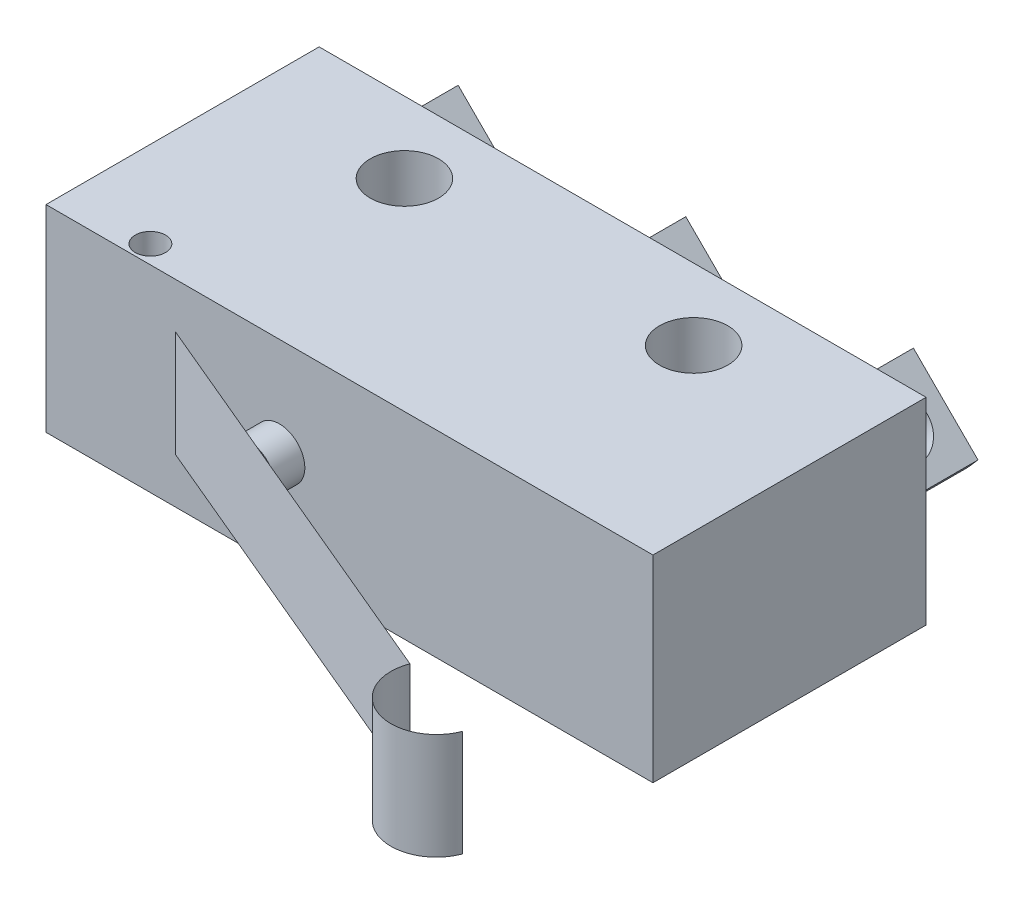
ISO-10303-21;
HEADER;
FILE_DESCRIPTION(('STEP AP214'),'2;1');
FILE_NAME('part.step','',(''),(''),'','','');
FILE_SCHEMA(('AUTOMOTIVE_DESIGN { 1 0 10303 214 1 1 1 1 }'));
ENDSEC;
DATA;
#1=APPLICATION_CONTEXT('core data for automotive mechanical design processes');
#2=APPLICATION_PROTOCOL_DEFINITION('international standard','automotive_design',2000,#1);
#3=PRODUCT_CONTEXT('',#1,'mechanical');
#4=PRODUCT('Part','Part','',(#3));
#5=PRODUCT_RELATED_PRODUCT_CATEGORY('part','',(#4));
#6=PRODUCT_DEFINITION_FORMATION('','',#4);
#7=PRODUCT_DEFINITION_CONTEXT('part definition',#1,'design');
#8=PRODUCT_DEFINITION('design','',#6,#7);
#9=PRODUCT_DEFINITION_SHAPE('','',#8);
#10=(LENGTH_UNIT() NAMED_UNIT(*) SI_UNIT(.MILLI.,.METRE.));
#11=(NAMED_UNIT(*) PLANE_ANGLE_UNIT() SI_UNIT($,.RADIAN.));
#12=(NAMED_UNIT(*) SI_UNIT($,.STERADIAN.) SOLID_ANGLE_UNIT());
#13=UNCERTAINTY_MEASURE_WITH_UNIT(LENGTH_MEASURE(1.E-05),#10,'distance_accuracy_value','');
#14=(GEOMETRIC_REPRESENTATION_CONTEXT(3) GLOBAL_UNCERTAINTY_ASSIGNED_CONTEXT((#13)) GLOBAL_UNIT_ASSIGNED_CONTEXT((#10,
#11,#12)) REPRESENTATION_CONTEXT('',''));
#15=CARTESIAN_POINT('',(0.,0.,0.));
#16=DIRECTION('',(0.,0.,1.));
#17=DIRECTION('',(1.,0.,0.));
#18=AXIS2_PLACEMENT_3D('',#15,#16,#17);
#19=CARTESIAN_POINT('',(-7.16,1.75,8.4));
#20=DIRECTION('',(0.38767769806464,0.,-0.921794989367648));
#21=DIRECTION('',(-0.921794989367648,0.,-0.38767769806464));
#22=AXIS2_PLACEMENT_3D('',#19,#20,#21);
#23=PLANE('',#22);
#24=DIRECTION('',(0.921794989367648,0.,0.38767769806464));
#25=VECTOR('',#24,1.);
#26=CARTESIAN_POINT('',(-7.16,-1.75,8.4));
#27=LINE('',#26,#25);
#28=CARTESIAN_POINT('',(-7.16,-1.75,8.4));
#29=VERTEX_POINT('',#28);
#30=CARTESIAN_POINT('',(7.60059402787761,-1.75,14.607837079609));
#31=VERTEX_POINT('',#30);
#32=EDGE_CURVE('E84',#29,#31,#27,.T.);
#33=ORIENTED_EDGE('',*,*,#32,.F.);
#34=DIRECTION('',(0.,-1.,0.));
#35=VECTOR('',#34,1.);
#36=CARTESIAN_POINT('',(-7.16,1.75,8.4));
#37=LINE('',#36,#35);
#38=CARTESIAN_POINT('',(-7.16,1.75,8.4));
#39=VERTEX_POINT('',#38);
#40=EDGE_CURVE('E53',#39,#29,#37,.T.);
#41=ORIENTED_EDGE('',*,*,#40,.F.);
#42=DIRECTION('',(0.921794989367648,0.,0.38767769806464));
#43=VECTOR('',#42,1.);
#44=CARTESIAN_POINT('',(-7.16,1.75,8.4));
#45=LINE('',#44,#43);
#46=CARTESIAN_POINT('',(7.60059402787761,1.75,14.607837079609));
#47=VERTEX_POINT('',#46);
#48=EDGE_CURVE('E12',#39,#47,#45,.T.);
#49=ORIENTED_EDGE('',*,*,#48,.T.);
#50=DIRECTION('',(0.,-1.,0.));
#51=VECTOR('',#50,1.);
#52=CARTESIAN_POINT('',(7.60059402787761,1.75,14.607837079609));
#53=LINE('',#52,#51);
#54=EDGE_CURVE('E77',#47,#31,#53,.T.);
#55=ORIENTED_EDGE('',*,*,#54,.T.);
#56=EDGE_LOOP('',(#33,#41,#49,#55));
#57=FACE_BOUND('',#56,.T.);
#58=ADVANCED_FACE('F51',(#57),#23,.T.);
#59=CARTESIAN_POINT('',(8.99802542059043,1.75,15.1373031903832));
#60=DIRECTION('',(0.,-1.,0.));
#61=DIRECTION('',(0.,0.,-1.));
#62=AXIS2_PLACEMENT_3D('',#59,#60,#61);
#63=CYLINDRICAL_SURFACE('',#62,1.49437239662599);
#64=CARTESIAN_POINT('',(8.99802542059043,-1.75,15.1373031903832));
#65=DIRECTION('',(0.,1.,0.));
#66=DIRECTION('',(0.,0.,1.));
#67=AXIS2_PLACEMENT_3D('',#64,#65,#66);
#68=CIRCLE('',#67,1.49437239662599);
#69=CARTESIAN_POINT('',(10.3954568133033,-1.75,15.6667693011574));
#70=VERTEX_POINT('',#69);
#71=EDGE_CURVE('E99',#31,#70,#68,.T.);
#72=ORIENTED_EDGE('',*,*,#71,.F.);
#73=ORIENTED_EDGE('',*,*,#54,.F.);
#74=CARTESIAN_POINT('',(8.99802542059043,1.75,15.1373031903832));
#75=DIRECTION('',(0.,1.,0.));
#76=DIRECTION('',(0.,0.,1.));
#77=AXIS2_PLACEMENT_3D('',#74,#75,#76);
#78=CIRCLE('',#77,1.49437239662599);
#79=CARTESIAN_POINT('',(10.3954568133033,1.75,15.6667693011574));
#80=VERTEX_POINT('',#79);
#81=EDGE_CURVE('E95',#47,#80,#78,.T.);
#82=ORIENTED_EDGE('',*,*,#81,.T.);
#83=DIRECTION('',(0.,-1.,0.));
#84=VECTOR('',#83,1.);
#85=CARTESIAN_POINT('',(10.3954568133033,1.75,15.6667693011574));
#86=LINE('',#85,#84);
#87=EDGE_CURVE('E64',#80,#70,#86,.T.);
#88=ORIENTED_EDGE('',*,*,#87,.T.);
#89=EDGE_LOOP('',(#72,#73,#82,#88));
#90=FACE_BOUND('',#89,.T.);
#91=ADVANCED_FACE('F103',(#90),#63,.F.);
#92=OPEN_SHELL('',(#58,#91));
#93=SHELL_BASED_SURFACE_MODEL('B2',(#92));
#94=CARTESIAN_POINT('',(0.,0.,0.));
#95=DIRECTION('',(0.,0.,-1.));
#96=DIRECTION('',(-1.,0.,0.));
#97=AXIS2_PLACEMENT_3D('',#94,#95,#96);
#98=PLANE('',#97);
#99=DIRECTION('',(-0.704771646919018,0.709434229297583,0.));
#100=VECTOR('',#99,1.);
#101=CARTESIAN_POINT('',(6.05858299437645,0.863179554578767,0.));
#102=LINE('',#101,#100);
#103=CARTESIAN_POINT('',(8.17289793513351,-1.26512313331398,0.));
#104=VERTEX_POINT('',#103);
#105=CARTESIAN_POINT('',(6.05858299437645,0.863179554578767,0.));
#106=VERTEX_POINT('',#105);
#107=EDGE_CURVE('E293',#104,#106,#102,.T.);
#108=ORIENTED_EDGE('',*,*,#107,.F.);
#109=DIRECTION('',(-0.661912131603017,-0.749581436560932,0.));
#110=VECTOR('',#109,1.);
#111=CARTESIAN_POINT('',(8.50990590111409,-0.88347894942447,0.));
#112=LINE('',#111,#110);
#113=CARTESIAN_POINT('',(8.50990590111409,-0.88347894942447,0.));
#114=VERTEX_POINT('',#113);
#115=EDGE_CURVE('E290',#114,#104,#112,.T.);
#116=ORIENTED_EDGE('',*,*,#115,.F.);
#117=DIRECTION('',(0.707106781186546,-0.707106781186549,0.));
#118=VECTOR('',#117,1.);
#119=CARTESIAN_POINT('',(6.38155502068045,1.24487193100917,0.));
#120=LINE('',#119,#118);
#121=CARTESIAN_POINT('',(6.38155502068045,1.24487193100917,0.));
#122=VERTEX_POINT('',#121);
#123=EDGE_CURVE('E283',#122,#114,#120,.T.);
#124=ORIENTED_EDGE('',*,*,#123,.F.);
#125=DIRECTION('',(0.645944052608,0.763384752860806,0.));
#126=VECTOR('',#125,1.);
#127=CARTESIAN_POINT('',(6.38155502068045,1.24487193100917,0.));
#128=LINE('',#127,#126);
#129=EDGE_CURVE('E295',#106,#122,#128,.T.);
#130=ORIENTED_EDGE('',*,*,#129,.F.);
#131=EDGE_LOOP('',(#108,#116,#124,#130));
#132=FACE_BOUND('',#131,.T.);
#133=DIRECTION('',(0.,1.,0.));
#134=VECTOR('',#133,1.);
#135=CARTESIAN_POINT('',(10.,-3.25,0.));
#136=LINE('',#135,#134);
#137=CARTESIAN_POINT('',(10.,-3.25,0.));
#138=VERTEX_POINT('',#137);
#139=CARTESIAN_POINT('',(10.,3.25,0.));
#140=VERTEX_POINT('',#139);
#141=EDGE_CURVE('E329',#138,#140,#136,.T.);
#142=ORIENTED_EDGE('',*,*,#141,.F.);
#143=DIRECTION('',(1.,0.,0.));
#144=VECTOR('',#143,1.);
#145=CARTESIAN_POINT('',(-9.99999999999999,-3.25,0.));
#146=LINE('',#145,#144);
#147=CARTESIAN_POINT('',(-9.99999999999999,-3.25,0.));
#148=VERTEX_POINT('',#147);
#149=EDGE_CURVE('E334',#148,#138,#146,.T.);
#150=ORIENTED_EDGE('',*,*,#149,.F.);
#151=DIRECTION('',(0.,-1.,0.));
#152=VECTOR('',#151,1.);
#153=CARTESIAN_POINT('',(-9.99999999999999,-3.25,0.));
#154=LINE('',#153,#152);
#155=CARTESIAN_POINT('',(-9.99999999999999,3.25,0.));
#156=VERTEX_POINT('',#155);
#157=EDGE_CURVE('E345',#156,#148,#154,.T.);
#158=ORIENTED_EDGE('',*,*,#157,.F.);
#159=DIRECTION('',(-1.,0.,0.));
#160=VECTOR('',#159,1.);
#161=CARTESIAN_POINT('',(-9.99999999999999,3.25,0.));
#162=LINE('',#161,#160);
#163=EDGE_CURVE('E343',#140,#156,#162,.T.);
#164=ORIENTED_EDGE('',*,*,#163,.F.);
#165=EDGE_LOOP('',(#142,#150,#158,#164));
#166=FACE_BOUND('',#165,.T.);
#167=DIRECTION('',(-0.704771646919018,0.709434229297583,0.));
#168=VECTOR('',#167,1.);
#169=CARTESIAN_POINT('',(-1.44141700562355,0.863179554578767,0.));
#170=LINE('',#169,#168);
#171=CARTESIAN_POINT('',(0.672897935133507,-1.26512313331398,0.));
#172=VERTEX_POINT('',#171);
#173=CARTESIAN_POINT('',(-1.44141700562355,0.863179554578767,0.));
#174=VERTEX_POINT('',#173);
#175=EDGE_CURVE('E269',#172,#174,#170,.T.);
#176=ORIENTED_EDGE('',*,*,#175,.F.);
#177=DIRECTION('',(-0.661912131603017,-0.749581436560932,0.));
#178=VECTOR('',#177,1.);
#179=CARTESIAN_POINT('',(1.00990590111409,-0.88347894942447,0.));
#180=LINE('',#179,#178);
#181=CARTESIAN_POINT('',(1.00990590111409,-0.88347894942447,0.));
#182=VERTEX_POINT('',#181);
#183=EDGE_CURVE('E261',#182,#172,#180,.T.);
#184=ORIENTED_EDGE('',*,*,#183,.F.);
#185=DIRECTION('',(0.707106781186546,-0.707106781186549,0.));
#186=VECTOR('',#185,1.);
#187=CARTESIAN_POINT('',(-1.11844497931955,1.24487193100917,0.));
#188=LINE('',#187,#186);
#189=CARTESIAN_POINT('',(-1.11844497931955,1.24487193100917,0.));
#190=VERTEX_POINT('',#189);
#191=EDGE_CURVE('E244',#190,#182,#188,.T.);
#192=ORIENTED_EDGE('',*,*,#191,.F.);
#193=DIRECTION('',(0.645944052608,0.763384752860806,0.));
#194=VECTOR('',#193,1.);
#195=CARTESIAN_POINT('',(-1.11844497931955,1.24487193100917,0.));
#196=LINE('',#195,#194);
#197=EDGE_CURVE('E754',#174,#190,#196,.T.);
#198=ORIENTED_EDGE('',*,*,#197,.F.);
#199=EDGE_LOOP('',(#176,#184,#192,#198));
#200=FACE_BOUND('',#199,.T.);
#201=DIRECTION('',(-0.661912131603017,-0.749581436560932,0.));
#202=VECTOR('',#201,1.);
#203=CARTESIAN_POINT('',(-6.49009409888591,-0.88347894942447,0.));
#204=LINE('',#203,#202);
#205=CARTESIAN_POINT('',(-6.49009409888591,-0.88347894942447,0.));
#206=VERTEX_POINT('',#205);
#207=CARTESIAN_POINT('',(-6.82710206486649,-1.26512313331398,0.));
#208=VERTEX_POINT('',#207);
#209=EDGE_CURVE('E362',#206,#208,#204,.T.);
#210=ORIENTED_EDGE('',*,*,#209,.F.);
#211=DIRECTION('',(0.707106781186546,-0.707106781186549,0.));
#212=VECTOR('',#211,1.);
#213=CARTESIAN_POINT('',(-8.61844497931954,1.24487193100917,0.));
#214=LINE('',#213,#212);
#215=CARTESIAN_POINT('',(-8.61844497931954,1.24487193100917,0.));
#216=VERTEX_POINT('',#215);
#217=EDGE_CURVE('E366',#216,#206,#214,.T.);
#218=ORIENTED_EDGE('',*,*,#217,.F.);
#219=DIRECTION('',(0.645944052608,0.763384752860806,0.));
#220=VECTOR('',#219,1.);
#221=CARTESIAN_POINT('',(-8.61844497931954,1.24487193100917,0.));
#222=LINE('',#221,#220);
#223=CARTESIAN_POINT('',(-8.94141700562355,0.863179554578767,0.));
#224=VERTEX_POINT('',#223);
#225=EDGE_CURVE('E369',#224,#216,#222,.T.);
#226=ORIENTED_EDGE('',*,*,#225,.F.);
#227=DIRECTION('',(-0.704771646919018,0.709434229297583,0.));
#228=VECTOR('',#227,1.);
#229=CARTESIAN_POINT('',(-8.94141700562355,0.863179554578767,0.));
#230=LINE('',#229,#228);
#231=EDGE_CURVE('E371',#208,#224,#230,.T.);
#232=ORIENTED_EDGE('',*,*,#231,.F.);
#233=EDGE_LOOP('',(#210,#218,#226,#232));
#234=FACE_BOUND('',#233,.T.);
#235=ADVANCED_FACE('F127',(#132,#166,#200,#234),#98,.T.);
#236=CARTESIAN_POINT('',(0.,0.,9.));
#237=DIRECTION('',(0.,0.,-1.));
#238=DIRECTION('',(-1.,0.,0.));
#239=AXIS2_PLACEMENT_3D('',#236,#237,#238);
#240=PLANE('',#239);
#241=DIRECTION('',(0.,1.,0.));
#242=VECTOR('',#241,1.);
#243=CARTESIAN_POINT('',(10.,-3.25,9.));
#244=LINE('',#243,#242);
#245=CARTESIAN_POINT('',(10.,-3.25,9.));
#246=VERTEX_POINT('',#245);
#247=CARTESIAN_POINT('',(10.,3.25,9.));
#248=VERTEX_POINT('',#247);
#249=EDGE_CURVE('E330',#246,#248,#244,.T.);
#250=ORIENTED_EDGE('',*,*,#249,.T.);
#251=DIRECTION('',(-1.,0.,0.));
#252=VECTOR('',#251,1.);
#253=CARTESIAN_POINT('',(-9.99999999999999,3.25,9.));
#254=LINE('',#253,#252);
#255=CARTESIAN_POINT('',(-9.99999999999999,3.25,9.));
#256=VERTEX_POINT('',#255);
#257=EDGE_CURVE('E333',#248,#256,#254,.T.);
#258=ORIENTED_EDGE('',*,*,#257,.T.);
#259=DIRECTION('',(0.,-1.,0.));
#260=VECTOR('',#259,1.);
#261=CARTESIAN_POINT('',(-9.99999999999999,-3.25,9.));
#262=LINE('',#261,#260);
#263=CARTESIAN_POINT('',(-9.99999999999999,-3.25,9.));
#264=VERTEX_POINT('',#263);
#265=EDGE_CURVE('E336',#256,#264,#262,.T.);
#266=ORIENTED_EDGE('',*,*,#265,.T.);
#267=DIRECTION('',(1.,0.,0.));
#268=VECTOR('',#267,1.);
#269=CARTESIAN_POINT('',(-9.99999999999999,-3.25,9.));
#270=LINE('',#269,#268);
#271=EDGE_CURVE('E338',#264,#246,#270,.T.);
#272=ORIENTED_EDGE('',*,*,#271,.T.);
#273=EDGE_LOOP('',(#250,#258,#266,#272));
#274=FACE_BOUND('',#273,.T.);
#275=CARTESIAN_POINT('',(-2.31,0.,9.));
#276=DIRECTION('',(0.,0.,-1.));
#277=DIRECTION('',(-1.,0.,0.));
#278=AXIS2_PLACEMENT_3D('',#275,#276,#277);
#279=CIRCLE('',#278,0.83839399873753);
#280=CARTESIAN_POINT('',(-3.14839399873753,0.,9.));
#281=VERTEX_POINT('',#280);
#282=EDGE_CURVE('E359',#281,#281,#279,.F.);
#283=ORIENTED_EDGE('',*,*,#282,.F.);
#284=EDGE_LOOP('',(#283));
#285=FACE_BOUND('',#284,.T.);
#286=ADVANCED_FACE('F403',(#274,#285),#240,.F.);
#287=CARTESIAN_POINT('',(10.,-3.25,9.));
#288=DIRECTION('',(-1.,0.,0.));
#289=DIRECTION('',(0.,0.,1.));
#290=AXIS2_PLACEMENT_3D('',#287,#288,#289);
#291=PLANE('',#290);
#292=ORIENTED_EDGE('',*,*,#141,.T.);
#293=DIRECTION('',(0.,0.,-1.));
#294=VECTOR('',#293,1.);
#295=CARTESIAN_POINT('',(10.,3.25,9.));
#296=LINE('',#295,#294);
#297=EDGE_CURVE('E356',#248,#140,#296,.T.);
#298=ORIENTED_EDGE('',*,*,#297,.F.);
#299=ORIENTED_EDGE('',*,*,#249,.F.);
#300=DIRECTION('',(0.,0.,-1.));
#301=VECTOR('',#300,1.);
#302=CARTESIAN_POINT('',(10.,-3.25,9.));
#303=LINE('',#302,#301);
#304=EDGE_CURVE('E340',#246,#138,#303,.T.);
#305=ORIENTED_EDGE('',*,*,#304,.T.);
#306=EDGE_LOOP('',(#292,#298,#299,#305));
#307=FACE_BOUND('',#306,.T.);
#308=ADVANCED_FACE('F409',(#307),#291,.F.);
#309=CARTESIAN_POINT('',(-9.99999999999999,3.25,9.));
#310=DIRECTION('',(0.,-1.,0.));
#311=DIRECTION('',(0.,0.,-1.));
#312=AXIS2_PLACEMENT_3D('',#309,#310,#311);
#313=PLANE('',#312);
#314=CARTESIAN_POINT('',(-7.16,3.25,8.4));
#315=DIRECTION('',(0.,-1.,0.));
#316=DIRECTION('',(0.,0.,-1.));
#317=AXIS2_PLACEMENT_3D('',#314,#315,#316);
#318=CIRCLE('',#317,0.500000000000013);
#319=CARTESIAN_POINT('',(-7.16,3.25,7.89999999999999));
#320=VERTEX_POINT('',#319);
#321=EDGE_CURVE('E311',#320,#320,#318,.T.);
#322=ORIENTED_EDGE('',*,*,#321,.T.);
#323=EDGE_LOOP('',(#322));
#324=FACE_BOUND('',#323,.T.);
#325=CARTESIAN_POINT('',(-4.83999999999999,3.25000000000001,2.35));
#326=DIRECTION('',(0.,-1.,0.));
#327=DIRECTION('',(0.,0.,-1.));
#328=AXIS2_PLACEMENT_3D('',#325,#326,#327);
#329=CIRCLE('',#328,1.12500000000001);
#330=CARTESIAN_POINT('',(-4.83999999999999,3.25000000000001,1.22499999999999));
#331=VERTEX_POINT('',#330);
#332=EDGE_CURVE('E320',#331,#331,#329,.T.);
#333=ORIENTED_EDGE('',*,*,#332,.T.);
#334=EDGE_LOOP('',(#333));
#335=FACE_BOUND('',#334,.T.);
#336=CARTESIAN_POINT('',(4.69,3.25000000000001,2.35));
#337=DIRECTION('',(0.,-1.,0.));
#338=DIRECTION('',(0.,0.,-1.));
#339=AXIS2_PLACEMENT_3D('',#336,#337,#338);
#340=CIRCLE('',#339,1.12500000000001);
#341=CARTESIAN_POINT('',(4.69,3.25000000000001,1.22499999999999));
#342=VERTEX_POINT('',#341);
#343=EDGE_CURVE('E326',#342,#342,#340,.T.);
#344=ORIENTED_EDGE('',*,*,#343,.T.);
#345=EDGE_LOOP('',(#344));
#346=FACE_BOUND('',#345,.T.);
#347=ORIENTED_EDGE('',*,*,#163,.T.);
#348=DIRECTION('',(0.,0.,-1.));
#349=VECTOR('',#348,1.);
#350=CARTESIAN_POINT('',(-9.99999999999999,3.25,9.));
#351=LINE('',#350,#349);
#352=EDGE_CURVE('E353',#256,#156,#351,.T.);
#353=ORIENTED_EDGE('',*,*,#352,.F.);
#354=ORIENTED_EDGE('',*,*,#257,.F.);
#355=ORIENTED_EDGE('',*,*,#297,.T.);
#356=EDGE_LOOP('',(#347,#353,#354,#355));
#357=FACE_BOUND('',#356,.T.);
#358=ADVANCED_FACE('F424',(#324,#335,#346,#357),#313,.F.);
#359=CARTESIAN_POINT('',(-9.99999999999999,-3.25,9.));
#360=DIRECTION('',(1.,0.,0.));
#361=DIRECTION('',(0.,0.,-1.));
#362=AXIS2_PLACEMENT_3D('',#359,#360,#361);
#363=PLANE('',#362);
#364=ORIENTED_EDGE('',*,*,#157,.T.);
#365=DIRECTION('',(0.,0.,-1.));
#366=VECTOR('',#365,1.);
#367=CARTESIAN_POINT('',(-9.99999999999999,-3.25,9.));
#368=LINE('',#367,#366);
#369=EDGE_CURVE('E350',#264,#148,#368,.T.);
#370=ORIENTED_EDGE('',*,*,#369,.F.);
#371=ORIENTED_EDGE('',*,*,#265,.F.);
#372=ORIENTED_EDGE('',*,*,#352,.T.);
#373=EDGE_LOOP('',(#364,#370,#371,#372));
#374=FACE_BOUND('',#373,.T.);
#375=ADVANCED_FACE('F420',(#374),#363,.F.);
#376=CARTESIAN_POINT('',(-9.99999999999999,-3.25,9.));
#377=DIRECTION('',(0.,1.,0.));
#378=DIRECTION('',(0.,0.,1.));
#379=AXIS2_PLACEMENT_3D('',#376,#377,#378);
#380=PLANE('',#379);
#381=CARTESIAN_POINT('',(-7.16,-3.25,8.4));
#382=DIRECTION('',(0.,-1.,0.));
#383=DIRECTION('',(0.,0.,-1.));
#384=AXIS2_PLACEMENT_3D('',#381,#382,#383);
#385=CIRCLE('',#384,0.500000000000013);
#386=CARTESIAN_POINT('',(-7.16,-3.25,7.89999999999999));
#387=VERTEX_POINT('',#386);
#388=EDGE_CURVE('E308',#387,#387,#385,.T.);
#389=ORIENTED_EDGE('',*,*,#388,.F.);
#390=EDGE_LOOP('',(#389));
#391=FACE_BOUND('',#390,.T.);
#392=CARTESIAN_POINT('',(-4.83999999999999,-3.25,2.35));
#393=DIRECTION('',(0.,-1.,0.));
#394=DIRECTION('',(0.,0.,-1.));
#395=AXIS2_PLACEMENT_3D('',#392,#393,#394);
#396=CIRCLE('',#395,1.12500000000001);
#397=CARTESIAN_POINT('',(-4.83999999999999,-3.25,1.22499999999999));
#398=VERTEX_POINT('',#397);
#399=EDGE_CURVE('E317',#398,#398,#396,.T.);
#400=ORIENTED_EDGE('',*,*,#399,.F.);
#401=EDGE_LOOP('',(#400));
#402=FACE_BOUND('',#401,.T.);
#403=CARTESIAN_POINT('',(4.69,-3.25,2.35));
#404=DIRECTION('',(0.,-1.,0.));
#405=DIRECTION('',(0.,0.,-1.));
#406=AXIS2_PLACEMENT_3D('',#403,#404,#405);
#407=CIRCLE('',#406,1.12500000000001);
#408=CARTESIAN_POINT('',(4.69,-3.25,1.22499999999999));
#409=VERTEX_POINT('',#408);
#410=EDGE_CURVE('E323',#409,#409,#407,.T.);
#411=ORIENTED_EDGE('',*,*,#410,.F.);
#412=EDGE_LOOP('',(#411));
#413=FACE_BOUND('',#412,.T.);
#414=ORIENTED_EDGE('',*,*,#149,.T.);
#415=ORIENTED_EDGE('',*,*,#304,.F.);
#416=ORIENTED_EDGE('',*,*,#271,.F.);
#417=ORIENTED_EDGE('',*,*,#369,.T.);
#418=EDGE_LOOP('',(#414,#415,#416,#417));
#419=FACE_BOUND('',#418,.T.);
#420=ADVANCED_FACE('F416',(#391,#402,#413,#419),#380,.F.);
#421=CARTESIAN_POINT('',(4.69,-3.25,2.35));
#422=DIRECTION('',(0.,-1.,0.));
#423=DIRECTION('',(0.,0.,-1.));
#424=AXIS2_PLACEMENT_3D('',#421,#422,#423);
#425=CYLINDRICAL_SURFACE('',#424,1.12500000000001);
#426=ORIENTED_EDGE('',*,*,#343,.F.);
#427=EDGE_LOOP('',(#426));
#428=FACE_BOUND('',#427,.T.);
#429=ORIENTED_EDGE('',*,*,#410,.T.);
#430=EDGE_LOOP('',(#429));
#431=FACE_BOUND('',#430,.T.);
#432=ADVANCED_FACE('F419',(#428,#431),#425,.F.);
#433=CARTESIAN_POINT('',(-4.83999999999999,-3.25,2.35));
#434=DIRECTION('',(0.,-1.,0.));
#435=DIRECTION('',(0.,0.,-1.));
#436=AXIS2_PLACEMENT_3D('',#433,#434,#435);
#437=CYLINDRICAL_SURFACE('',#436,1.12500000000001);
#438=ORIENTED_EDGE('',*,*,#332,.F.);
#439=EDGE_LOOP('',(#438));
#440=FACE_BOUND('',#439,.T.);
#441=ORIENTED_EDGE('',*,*,#399,.T.);
#442=EDGE_LOOP('',(#441));
#443=FACE_BOUND('',#442,.T.);
#444=ADVANCED_FACE('F512',(#440,#443),#437,.F.);
#445=CARTESIAN_POINT('',(-2.31,0.,10.));
#446=DIRECTION('',(0.,0.,-1.));
#447=DIRECTION('',(-1.,0.,0.));
#448=AXIS2_PLACEMENT_3D('',#445,#446,#447);
#449=CYLINDRICAL_SURFACE('',#448,0.83839399873753);
#450=CARTESIAN_POINT('',(-2.31,0.,10.));
#451=DIRECTION('',(0.,0.,1.));
#452=DIRECTION('',(1.,0.,0.));
#453=AXIS2_PLACEMENT_3D('',#450,#451,#452);
#454=CIRCLE('',#453,0.83839399873753);
#455=CARTESIAN_POINT('',(-1.47160600126247,0.,10.));
#456=VERTEX_POINT('',#455);
#457=EDGE_CURVE('E314',#456,#456,#454,.T.);
#458=ORIENTED_EDGE('',*,*,#457,.F.);
#459=EDGE_LOOP('',(#458));
#460=FACE_BOUND('',#459,.T.);
#461=ORIENTED_EDGE('',*,*,#282,.T.);
#462=EDGE_LOOP('',(#461));
#463=FACE_BOUND('',#462,.T.);
#464=ADVANCED_FACE('F508',(#460,#463),#449,.T.);
#465=CARTESIAN_POINT('',(-2.31,0.,10.));
#466=DIRECTION('',(0.,0.,1.));
#467=DIRECTION('',(1.,0.,0.));
#468=AXIS2_PLACEMENT_3D('',#465,#466,#467);
#469=PLANE('',#468);
#470=ORIENTED_EDGE('',*,*,#457,.T.);
#471=EDGE_LOOP('',(#470));
#472=FACE_BOUND('',#471,.T.);
#473=ADVANCED_FACE('F504',(#472),#469,.T.);
#474=CARTESIAN_POINT('',(-7.16,-3.25,8.4));
#475=DIRECTION('',(0.,-1.,0.));
#476=DIRECTION('',(0.,0.,-1.));
#477=AXIS2_PLACEMENT_3D('',#474,#475,#476);
#478=CYLINDRICAL_SURFACE('',#477,0.500000000000013);
#479=ORIENTED_EDGE('',*,*,#321,.F.);
#480=EDGE_LOOP('',(#479));
#481=FACE_BOUND('',#480,.T.);
#482=ORIENTED_EDGE('',*,*,#388,.T.);
#483=EDGE_LOOP('',(#482));
#484=FACE_BOUND('',#483,.T.);
#485=ADVANCED_FACE('F500',(#481,#484),#478,.F.);
#486=CARTESIAN_POINT('',(8.50990590111409,-0.88347894942447,-3.2));
#487=DIRECTION('',(-0.749581436560932,0.661912131603017,0.));
#488=DIRECTION('',(-0.661912131603017,-0.749581436560932,0.));
#489=AXIS2_PLACEMENT_3D('',#486,#487,#488);
#490=PLANE('',#489);
#491=ORIENTED_EDGE('',*,*,#115,.T.);
#492=DIRECTION('',(0.,0.,1.));
#493=VECTOR('',#492,1.);
#494=CARTESIAN_POINT('',(8.17289793513351,-1.26512313331398,-3.2));
#495=LINE('',#494,#493);
#496=CARTESIAN_POINT('',(8.17289793513351,-1.26512313331398,-3.2));
#497=VERTEX_POINT('',#496);
#498=EDGE_CURVE('E306',#497,#104,#495,.T.);
#499=ORIENTED_EDGE('',*,*,#498,.F.);
#500=DIRECTION('',(-0.661912131603017,-0.749581436560932,0.));
#501=VECTOR('',#500,1.);
#502=CARTESIAN_POINT('',(8.50990590111409,-0.88347894942447,-3.2));
#503=LINE('',#502,#501);
#504=CARTESIAN_POINT('',(8.50990590111409,-0.88347894942447,-3.2));
#505=VERTEX_POINT('',#504);
#506=EDGE_CURVE('E279',#505,#497,#503,.T.);
#507=ORIENTED_EDGE('',*,*,#506,.F.);
#508=DIRECTION('',(0.,0.,1.));
#509=VECTOR('',#508,1.);
#510=CARTESIAN_POINT('',(8.50990590111409,-0.88347894942447,-3.2));
#511=LINE('',#510,#509);
#512=EDGE_CURVE('E289',#505,#114,#511,.T.);
#513=ORIENTED_EDGE('',*,*,#512,.T.);
#514=EDGE_LOOP('',(#491,#499,#507,#513));
#515=FACE_BOUND('',#514,.T.);
#516=ADVANCED_FACE('F496',(#515),#490,.F.);
#517=CARTESIAN_POINT('',(6.05858299437645,0.863179554578767,-3.2));
#518=DIRECTION('',(0.709434229297583,0.704771646919018,0.));
#519=DIRECTION('',(-0.704771646919018,0.709434229297583,0.));
#520=AXIS2_PLACEMENT_3D('',#517,#518,#519);
#521=PLANE('',#520);
#522=CARTESIAN_POINT('',(7.08648283467132,-0.171520598559609,-1.7));
#523=DIRECTION('',(0.709434229297583,0.704771646919018,0.));
#524=DIRECTION('',(-0.704771646919018,0.709434229297583,0.));
#525=AXIS2_PLACEMENT_3D('',#522,#523,#524);
#526=ELLIPSE('',#525,0.900004891466639,0.900000000000013);
#527=CARTESIAN_POINT('',(6.4521849050772,0.46697367798208,-1.7));
#528=VERTEX_POINT('',#527);
#529=EDGE_CURVE('E274',#528,#528,#526,.T.);
#530=ORIENTED_EDGE('',*,*,#529,.T.);
#531=EDGE_LOOP('',(#530));
#532=FACE_BOUND('',#531,.T.);
#533=ORIENTED_EDGE('',*,*,#107,.T.);
#534=DIRECTION('',(0.,0.,1.));
#535=VECTOR('',#534,1.);
#536=CARTESIAN_POINT('',(6.05858299437645,0.863179554578767,-3.2));
#537=LINE('',#536,#535);
#538=CARTESIAN_POINT('',(6.05858299437645,0.863179554578767,-3.2));
#539=VERTEX_POINT('',#538);
#540=EDGE_CURVE('E303',#539,#106,#537,.T.);
#541=ORIENTED_EDGE('',*,*,#540,.F.);
#542=DIRECTION('',(-0.704771646919018,0.709434229297583,0.));
#543=VECTOR('',#542,1.);
#544=CARTESIAN_POINT('',(6.05858299437645,0.863179554578767,-3.2));
#545=LINE('',#544,#543);
#546=EDGE_CURVE('E282',#497,#539,#545,.T.);
#547=ORIENTED_EDGE('',*,*,#546,.F.);
#548=ORIENTED_EDGE('',*,*,#498,.T.);
#549=EDGE_LOOP('',(#533,#541,#547,#548));
#550=FACE_BOUND('',#549,.T.);
#551=ADVANCED_FACE('F492',(#532,#550),#521,.F.);
#552=CARTESIAN_POINT('',(6.38155502068045,1.24487193100917,-3.2));
#553=DIRECTION('',(0.763384752860806,-0.645944052608,0.));
#554=DIRECTION('',(0.645944052608,0.763384752860806,0.));
#555=AXIS2_PLACEMENT_3D('',#552,#553,#554);
#556=PLANE('',#555);
#557=ORIENTED_EDGE('',*,*,#129,.T.);
#558=DIRECTION('',(0.,0.,1.));
#559=VECTOR('',#558,1.);
#560=CARTESIAN_POINT('',(6.38155502068045,1.24487193100917,-3.2));
#561=LINE('',#560,#559);
#562=CARTESIAN_POINT('',(6.38155502068045,1.24487193100917,-3.2));
#563=VERTEX_POINT('',#562);
#564=EDGE_CURVE('E301',#563,#122,#561,.T.);
#565=ORIENTED_EDGE('',*,*,#564,.F.);
#566=DIRECTION('',(0.645944052608,0.763384752860806,0.));
#567=VECTOR('',#566,1.);
#568=CARTESIAN_POINT('',(6.38155502068045,1.24487193100917,-3.2));
#569=LINE('',#568,#567);
#570=EDGE_CURVE('E285',#539,#563,#569,.T.);
#571=ORIENTED_EDGE('',*,*,#570,.F.);
#572=ORIENTED_EDGE('',*,*,#540,.T.);
#573=EDGE_LOOP('',(#557,#565,#571,#572));
#574=FACE_BOUND('',#573,.T.);
#575=ADVANCED_FACE('F488',(#574),#556,.F.);
#576=CARTESIAN_POINT('',(6.38155502068045,1.24487193100917,-3.2));
#577=DIRECTION('',(-0.707106781186549,-0.707106781186546,0.));
#578=DIRECTION('',(0.707106781186546,-0.707106781186549,0.));
#579=AXIS2_PLACEMENT_3D('',#576,#577,#578);
#580=PLANE('',#579);
#581=CARTESIAN_POINT('',(7.44221519246027,0.184211759229347,-1.7));
#582=DIRECTION('',(0.707106781186549,0.707106781186546,0.));
#583=DIRECTION('',(-0.707106781186546,0.707106781186549,0.));
#584=AXIS2_PLACEMENT_3D('',#581,#582,#583);
#585=CIRCLE('',#584,0.900000000000014);
#586=CARTESIAN_POINT('',(6.80581908939237,0.820607862297251,-1.7));
#587=VERTEX_POINT('',#586);
#588=EDGE_CURVE('E270',#587,#587,#585,.T.);
#589=ORIENTED_EDGE('',*,*,#588,.F.);
#590=EDGE_LOOP('',(#589));
#591=FACE_BOUND('',#590,.T.);
#592=ORIENTED_EDGE('',*,*,#123,.T.);
#593=ORIENTED_EDGE('',*,*,#512,.F.);
#594=DIRECTION('',(0.707106781186546,-0.707106781186549,0.));
#595=VECTOR('',#594,1.);
#596=CARTESIAN_POINT('',(6.38155502068045,1.24487193100917,-3.2));
#597=LINE('',#596,#595);
#598=EDGE_CURVE('E287',#563,#505,#597,.T.);
#599=ORIENTED_EDGE('',*,*,#598,.F.);
#600=ORIENTED_EDGE('',*,*,#564,.T.);
#601=EDGE_LOOP('',(#592,#593,#599,#600));
#602=FACE_BOUND('',#601,.T.);
#603=ADVANCED_FACE('F484',(#591,#602),#580,.F.);
#604=CARTESIAN_POINT('',(0.,0.,-3.2));
#605=DIRECTION('',(0.,0.,1.));
#606=DIRECTION('',(1.,0.,0.));
#607=AXIS2_PLACEMENT_3D('',#604,#605,#606);
#608=PLANE('',#607);
#609=ORIENTED_EDGE('',*,*,#506,.T.);
#610=ORIENTED_EDGE('',*,*,#546,.T.);
#611=ORIENTED_EDGE('',*,*,#570,.T.);
#612=ORIENTED_EDGE('',*,*,#598,.T.);
#613=EDGE_LOOP('',(#609,#610,#611,#612));
#614=FACE_BOUND('',#613,.T.);
#615=ADVANCED_FACE('F480',(#614),#608,.F.);
#616=CARTESIAN_POINT('',(7.44221519246027,0.184211759229347,-1.7));
#617=DIRECTION('',(0.707106781186549,0.707106781186546,0.));
#618=DIRECTION('',(-0.707106781186546,0.707106781186549,0.));
#619=AXIS2_PLACEMENT_3D('',#616,#617,#618);
#620=CYLINDRICAL_SURFACE('',#619,0.900000000000013);
#621=ORIENTED_EDGE('',*,*,#588,.T.);
#622=EDGE_LOOP('',(#621));
#623=FACE_BOUND('',#622,.T.);
#624=ORIENTED_EDGE('',*,*,#529,.F.);
#625=EDGE_LOOP('',(#624));
#626=FACE_BOUND('',#625,.T.);
#627=ADVANCED_FACE('F477',(#623,#626),#620,.F.);
#628=CARTESIAN_POINT('',(1.00990590111409,-0.88347894942447,-3.2));
#629=DIRECTION('',(-0.749581436560932,0.661912131603017,0.));
#630=DIRECTION('',(-0.661912131603017,-0.749581436560932,0.));
#631=AXIS2_PLACEMENT_3D('',#628,#629,#630);
#632=PLANE('',#631);
#633=ORIENTED_EDGE('',*,*,#183,.T.);
#634=DIRECTION('',(0.,0.,1.));
#635=VECTOR('',#634,1.);
#636=CARTESIAN_POINT('',(0.672897935133507,-1.26512313331398,-3.2));
#637=LINE('',#636,#635);
#638=CARTESIAN_POINT('',(0.672897935133507,-1.26512313331398,-3.2));
#639=VERTEX_POINT('',#638);
#640=EDGE_CURVE('E271',#639,#172,#637,.T.);
#641=ORIENTED_EDGE('',*,*,#640,.F.);
#642=DIRECTION('',(-0.661912131603017,-0.749581436560932,0.));
#643=VECTOR('',#642,1.);
#644=CARTESIAN_POINT('',(1.00990590111409,-0.88347894942447,-3.2));
#645=LINE('',#644,#643);
#646=CARTESIAN_POINT('',(1.00990590111409,-0.88347894942447,-3.2));
#647=VERTEX_POINT('',#646);
#648=EDGE_CURVE('E263',#647,#639,#645,.T.);
#649=ORIENTED_EDGE('',*,*,#648,.F.);
#650=DIRECTION('',(0.,0.,1.));
#651=VECTOR('',#650,1.);
#652=CARTESIAN_POINT('',(1.00990590111409,-0.88347894942447,-3.2));
#653=LINE('',#652,#651);
#654=EDGE_CURVE('E247',#647,#182,#653,.T.);
#655=ORIENTED_EDGE('',*,*,#654,.T.);
#656=EDGE_LOOP('',(#633,#641,#649,#655));
#657=FACE_BOUND('',#656,.T.);
#658=ADVANCED_FACE('F259',(#657),#632,.F.);
#659=CARTESIAN_POINT('',(-1.44141700562355,0.863179554578767,-3.2));
#660=DIRECTION('',(0.709434229297583,0.704771646919018,0.));
#661=DIRECTION('',(-0.704771646919018,0.709434229297583,0.));
#662=AXIS2_PLACEMENT_3D('',#659,#660,#661);
#663=PLANE('',#662);
#664=CARTESIAN_POINT('',(-0.413517165328684,-0.171520598559609,-1.7));
#665=DIRECTION('',(0.709434229297583,0.704771646919018,0.));
#666=DIRECTION('',(-0.704771646919018,0.709434229297583,0.));
#667=AXIS2_PLACEMENT_3D('',#664,#665,#666);
#668=ELLIPSE('',#667,0.900004891466639,0.900000000000013);
#669=CARTESIAN_POINT('',(-1.0478150949228,0.46697367798208,-1.7));
#670=VERTEX_POINT('',#669);
#671=EDGE_CURVE('E265',#670,#670,#668,.T.);
#672=ORIENTED_EDGE('',*,*,#671,.T.);
#673=EDGE_LOOP('',(#672));
#674=FACE_BOUND('',#673,.T.);
#675=ORIENTED_EDGE('',*,*,#175,.T.);
#676=DIRECTION('',(0.,0.,1.));
#677=VECTOR('',#676,1.);
#678=CARTESIAN_POINT('',(-1.44141700562355,0.863179554578767,-3.2));
#679=LINE('',#678,#677);
#680=CARTESIAN_POINT('',(-1.44141700562355,0.863179554578767,-3.2));
#681=VERTEX_POINT('',#680);
#682=EDGE_CURVE('E753',#681,#174,#679,.T.);
#683=ORIENTED_EDGE('',*,*,#682,.F.);
#684=DIRECTION('',(-0.704771646919018,0.709434229297583,0.));
#685=VECTOR('',#684,1.);
#686=CARTESIAN_POINT('',(-1.44141700562355,0.863179554578767,-3.2));
#687=LINE('',#686,#685);
#688=EDGE_CURVE('E759',#639,#681,#687,.T.);
#689=ORIENTED_EDGE('',*,*,#688,.F.);
#690=ORIENTED_EDGE('',*,*,#640,.T.);
#691=EDGE_LOOP('',(#675,#683,#689,#690));
#692=FACE_BOUND('',#691,.T.);
#693=ADVANCED_FACE('F470',(#674,#692),#663,.F.);
#694=CARTESIAN_POINT('',(-1.11844497931955,1.24487193100917,-3.2));
#695=DIRECTION('',(0.763384752860806,-0.645944052608,0.));
#696=DIRECTION('',(0.645944052608,0.763384752860806,0.));
#697=AXIS2_PLACEMENT_3D('',#694,#695,#696);
#698=PLANE('',#697);
#699=ORIENTED_EDGE('',*,*,#197,.T.);
#700=DIRECTION('',(0.,0.,1.));
#701=VECTOR('',#700,1.);
#702=CARTESIAN_POINT('',(-1.11844497931955,1.24487193100917,-3.2));
#703=LINE('',#702,#701);
#704=CARTESIAN_POINT('',(-1.11844497931955,1.24487193100917,-3.2));
#705=VERTEX_POINT('',#704);
#706=EDGE_CURVE('E250',#705,#190,#703,.T.);
#707=ORIENTED_EDGE('',*,*,#706,.F.);
#708=DIRECTION('',(0.645944052608,0.763384752860806,0.));
#709=VECTOR('',#708,1.);
#710=CARTESIAN_POINT('',(-1.11844497931955,1.24487193100917,-3.2));
#711=LINE('',#710,#709);
#712=EDGE_CURVE('E755',#681,#705,#711,.T.);
#713=ORIENTED_EDGE('',*,*,#712,.F.);
#714=ORIENTED_EDGE('',*,*,#682,.T.);
#715=EDGE_LOOP('',(#699,#707,#713,#714));
#716=FACE_BOUND('',#715,.T.);
#717=ADVANCED_FACE('F466',(#716),#698,.F.);
#718=CARTESIAN_POINT('',(-7.5,0.,-3.2));
#719=DIRECTION('',(0.,0.,1.));
#720=DIRECTION('',(1.,0.,0.));
#721=AXIS2_PLACEMENT_3D('',#718,#719,#720);
#722=PLANE('',#721);
#723=ORIENTED_EDGE('',*,*,#648,.T.);
#724=ORIENTED_EDGE('',*,*,#688,.T.);
#725=ORIENTED_EDGE('',*,*,#712,.T.);
#726=DIRECTION('',(0.707106781186546,-0.707106781186549,0.));
#727=VECTOR('',#726,1.);
#728=CARTESIAN_POINT('',(-1.11844497931955,1.24487193100917,-3.2));
#729=LINE('',#728,#727);
#730=EDGE_CURVE('E264',#705,#647,#729,.T.);
#731=ORIENTED_EDGE('',*,*,#730,.T.);
#732=EDGE_LOOP('',(#723,#724,#725,#731));
#733=FACE_BOUND('',#732,.T.);
#734=ADVANCED_FACE('F458',(#733),#722,.F.);
#735=CARTESIAN_POINT('',(-1.11844497931955,1.24487193100917,-3.2));
#736=DIRECTION('',(-0.707106781186549,-0.707106781186546,0.));
#737=DIRECTION('',(0.707106781186546,-0.707106781186549,0.));
#738=AXIS2_PLACEMENT_3D('',#735,#736,#737);
#739=PLANE('',#738);
#740=CARTESIAN_POINT('',(-0.0577848075397269,0.184211759229347,-1.7));
#741=DIRECTION('',(0.707106781186549,0.707106781186546,0.));
#742=DIRECTION('',(-0.707106781186546,0.707106781186549,0.));
#743=AXIS2_PLACEMENT_3D('',#740,#741,#742);
#744=CIRCLE('',#743,0.900000000000014);
#745=CARTESIAN_POINT('',(-0.694180910607628,0.820607862297251,-1.7));
#746=VERTEX_POINT('',#745);
#747=EDGE_CURVE('E254',#746,#746,#744,.T.);
#748=ORIENTED_EDGE('',*,*,#747,.F.);
#749=EDGE_LOOP('',(#748));
#750=FACE_BOUND('',#749,.T.);
#751=ORIENTED_EDGE('',*,*,#191,.T.);
#752=ORIENTED_EDGE('',*,*,#654,.F.);
#753=ORIENTED_EDGE('',*,*,#730,.F.);
#754=ORIENTED_EDGE('',*,*,#706,.T.);
#755=EDGE_LOOP('',(#751,#752,#753,#754));
#756=FACE_BOUND('',#755,.T.);
#757=ADVANCED_FACE('F246',(#750,#756),#739,.F.);
#758=CARTESIAN_POINT('',(-0.0577848075397269,0.184211759229347,-1.7));
#759=DIRECTION('',(0.707106781186549,0.707106781186546,0.));
#760=DIRECTION('',(-0.707106781186546,0.707106781186549,0.));
#761=AXIS2_PLACEMENT_3D('',#758,#759,#760);
#762=CYLINDRICAL_SURFACE('',#761,0.900000000000013);
#763=ORIENTED_EDGE('',*,*,#747,.T.);
#764=EDGE_LOOP('',(#763));
#765=FACE_BOUND('',#764,.T.);
#766=ORIENTED_EDGE('',*,*,#671,.F.);
#767=EDGE_LOOP('',(#766));
#768=FACE_BOUND('',#767,.T.);
#769=ADVANCED_FACE('F445',(#765,#768),#762,.F.);
#770=CARTESIAN_POINT('',(-7.55778480753973,0.184211759229347,-1.7));
#771=DIRECTION('',(0.707106781186549,0.707106781186546,0.));
#772=DIRECTION('',(-0.707106781186546,0.707106781186549,0.));
#773=AXIS2_PLACEMENT_3D('',#770,#771,#772);
#774=CYLINDRICAL_SURFACE('',#773,0.900000000000013);
#775=CARTESIAN_POINT('',(-7.55778480753973,0.184211759229347,-1.7));
#776=DIRECTION('',(0.707106781186549,0.707106781186546,0.));
#777=DIRECTION('',(-0.707106781186546,0.707106781186549,0.));
#778=AXIS2_PLACEMENT_3D('',#775,#776,#777);
#779=CIRCLE('',#778,0.900000000000014);
#780=CARTESIAN_POINT('',(-8.19418091060763,0.820607862297251,-1.7));
#781=VERTEX_POINT('',#780);
#782=EDGE_CURVE('E49',#781,#781,#779,.T.);
#783=ORIENTED_EDGE('',*,*,#782,.T.);
#784=EDGE_LOOP('',(#783));
#785=FACE_BOUND('',#784,.T.);
#786=CARTESIAN_POINT('',(-7.91351716532868,-0.171520598559609,-1.7));
#787=DIRECTION('',(0.709434229297583,0.704771646919018,0.));
#788=DIRECTION('',(-0.704771646919018,0.709434229297583,0.));
#789=AXIS2_PLACEMENT_3D('',#786,#787,#788);
#790=ELLIPSE('',#789,0.900004891466639,0.900000000000013);
#791=CARTESIAN_POINT('',(-8.5478150949228,0.46697367798208,-1.7));
#792=VERTEX_POINT('',#791);
#793=EDGE_CURVE('E382',#792,#792,#790,.T.);
#794=ORIENTED_EDGE('',*,*,#793,.F.);
#795=EDGE_LOOP('',(#794));
#796=FACE_BOUND('',#795,.T.);
#797=ADVANCED_FACE('F129',(#785,#796),#774,.F.);
#798=CARTESIAN_POINT('',(-8.61844497931954,1.24487193100917,-3.2));
#799=DIRECTION('',(-0.707106781186549,-0.707106781186546,0.));
#800=DIRECTION('',(0.707106781186546,-0.707106781186549,0.));
#801=AXIS2_PLACEMENT_3D('',#798,#799,#800);
#802=PLANE('',#801);
#803=ORIENTED_EDGE('',*,*,#782,.F.);
#804=EDGE_LOOP('',(#803));
#805=FACE_BOUND('',#804,.T.);
#806=ORIENTED_EDGE('',*,*,#217,.T.);
#807=DIRECTION('',(0.,0.,1.));
#808=VECTOR('',#807,1.);
#809=CARTESIAN_POINT('',(-6.49009409888591,-0.88347894942447,-3.2));
#810=LINE('',#809,#808);
#811=CARTESIAN_POINT('',(-6.49009409888591,-0.88347894942447,-3.2));
#812=VERTEX_POINT('',#811);
#813=EDGE_CURVE('E379',#812,#206,#810,.T.);
#814=ORIENTED_EDGE('',*,*,#813,.F.);
#815=DIRECTION('',(0.707106781186546,-0.707106781186549,0.));
#816=VECTOR('',#815,1.);
#817=CARTESIAN_POINT('',(-8.61844497931954,1.24487193100917,-3.2));
#818=LINE('',#817,#816);
#819=CARTESIAN_POINT('',(-8.61844497931954,1.24487193100917,-3.2));
#820=VERTEX_POINT('',#819);
#821=EDGE_CURVE('E135',#820,#812,#818,.T.);
#822=ORIENTED_EDGE('',*,*,#821,.F.);
#823=DIRECTION('',(0.,0.,1.));
#824=VECTOR('',#823,1.);
#825=CARTESIAN_POINT('',(-8.61844497931954,1.24487193100917,-3.2));
#826=LINE('',#825,#824);
#827=EDGE_CURVE('E142',#820,#216,#826,.T.);
#828=ORIENTED_EDGE('',*,*,#827,.T.);
#829=EDGE_LOOP('',(#806,#814,#822,#828));
#830=FACE_BOUND('',#829,.T.);
#831=ADVANCED_FACE('F396',(#805,#830),#802,.F.);
#832=CARTESIAN_POINT('',(-15.,0.,-3.2));
#833=DIRECTION('',(0.,0.,1.));
#834=DIRECTION('',(1.,0.,0.));
#835=AXIS2_PLACEMENT_3D('',#832,#833,#834);
#836=PLANE('',#835);
#837=DIRECTION('',(-0.661912131603017,-0.749581436560932,0.));
#838=VECTOR('',#837,1.);
#839=CARTESIAN_POINT('',(-6.49009409888591,-0.88347894942447,-3.2));
#840=LINE('',#839,#838);
#841=CARTESIAN_POINT('',(-6.82710206486649,-1.26512313331398,-3.2));
#842=VERTEX_POINT('',#841);
#843=EDGE_CURVE('E376',#812,#842,#840,.T.);
#844=ORIENTED_EDGE('',*,*,#843,.T.);
#845=DIRECTION('',(-0.704771646919018,0.709434229297583,0.));
#846=VECTOR('',#845,1.);
#847=CARTESIAN_POINT('',(-8.94141700562355,0.863179554578767,-3.2));
#848=LINE('',#847,#846);
#849=CARTESIAN_POINT('',(-8.94141700562355,0.863179554578767,-3.2));
#850=VERTEX_POINT('',#849);
#851=EDGE_CURVE('E386',#842,#850,#848,.T.);
#852=ORIENTED_EDGE('',*,*,#851,.T.);
#853=DIRECTION('',(0.645944052608,0.763384752860806,0.));
#854=VECTOR('',#853,1.);
#855=CARTESIAN_POINT('',(-8.61844497931954,1.24487193100917,-3.2));
#856=LINE('',#855,#854);
#857=EDGE_CURVE('E389',#850,#820,#856,.T.);
#858=ORIENTED_EDGE('',*,*,#857,.T.);
#859=ORIENTED_EDGE('',*,*,#821,.T.);
#860=EDGE_LOOP('',(#844,#852,#858,#859));
#861=FACE_BOUND('',#860,.T.);
#862=ADVANCED_FACE('F393',(#861),#836,.F.);
#863=CARTESIAN_POINT('',(-8.61844497931954,1.24487193100917,-3.2));
#864=DIRECTION('',(0.763384752860806,-0.645944052608,0.));
#865=DIRECTION('',(0.645944052608,0.763384752860806,0.));
#866=AXIS2_PLACEMENT_3D('',#863,#864,#865);
#867=PLANE('',#866);
#868=ORIENTED_EDGE('',*,*,#225,.T.);
#869=ORIENTED_EDGE('',*,*,#827,.F.);
#870=ORIENTED_EDGE('',*,*,#857,.F.);
#871=DIRECTION('',(0.,0.,1.));
#872=VECTOR('',#871,1.);
#873=CARTESIAN_POINT('',(-8.94141700562355,0.863179554578767,-3.2));
#874=LINE('',#873,#872);
#875=EDGE_CURVE('E150',#850,#224,#874,.T.);
#876=ORIENTED_EDGE('',*,*,#875,.T.);
#877=EDGE_LOOP('',(#868,#869,#870,#876));
#878=FACE_BOUND('',#877,.T.);
#879=ADVANCED_FACE('F401',(#878),#867,.F.);
#880=CARTESIAN_POINT('',(-8.94141700562355,0.863179554578767,-3.2));
#881=DIRECTION('',(0.709434229297583,0.704771646919018,0.));
#882=DIRECTION('',(-0.704771646919018,0.709434229297583,0.));
#883=AXIS2_PLACEMENT_3D('',#880,#881,#882);
#884=PLANE('',#883);
#885=ORIENTED_EDGE('',*,*,#793,.T.);
#886=EDGE_LOOP('',(#885));
#887=FACE_BOUND('',#886,.T.);
#888=ORIENTED_EDGE('',*,*,#231,.T.);
#889=ORIENTED_EDGE('',*,*,#875,.F.);
#890=ORIENTED_EDGE('',*,*,#851,.F.);
#891=DIRECTION('',(0.,0.,1.));
#892=VECTOR('',#891,1.);
#893=CARTESIAN_POINT('',(-6.82710206486649,-1.26512313331398,-3.2));
#894=LINE('',#893,#892);
#895=EDGE_CURVE('E373',#842,#208,#894,.T.);
#896=ORIENTED_EDGE('',*,*,#895,.T.);
#897=EDGE_LOOP('',(#888,#889,#890,#896));
#898=FACE_BOUND('',#897,.T.);
#899=ADVANCED_FACE('F400',(#887,#898),#884,.F.);
#900=CARTESIAN_POINT('',(-6.49009409888591,-0.88347894942447,-3.2));
#901=DIRECTION('',(-0.749581436560932,0.661912131603017,0.));
#902=DIRECTION('',(-0.661912131603017,-0.749581436560932,0.));
#903=AXIS2_PLACEMENT_3D('',#900,#901,#902);
#904=PLANE('',#903);
#905=ORIENTED_EDGE('',*,*,#209,.T.);
#906=ORIENTED_EDGE('',*,*,#895,.F.);
#907=ORIENTED_EDGE('',*,*,#843,.F.);
#908=ORIENTED_EDGE('',*,*,#813,.T.);
#909=EDGE_LOOP('',(#905,#906,#907,#908));
#910=FACE_BOUND('',#909,.T.);
#911=ADVANCED_FACE('F398',(#910),#904,.F.);
#912=CLOSED_SHELL('',(#235,#286,#308,#358,#375,#420,#432,#444,#464,#473,#485,#516,#551,#575,
#603,#615,#627,#658,#693,#717,#734,#757,#769,#797,#831,#862,#879,#899,#911));
#913=MANIFOLD_SOLID_BREP('B6',#912);
#914=ADVANCED_BREP_SHAPE_REPRESENTATION('',(#18,#913),#14);
#915=MANIFOLD_SURFACE_SHAPE_REPRESENTATION('',(#18,#93),#14);
#916=SHAPE_REPRESENTATION('',(#18),#14);
#917=SHAPE_DEFINITION_REPRESENTATION(#9,#916);
#918=SHAPE_REPRESENTATION_RELATIONSHIP('','',#916,#914);
#919=SHAPE_REPRESENTATION_RELATIONSHIP('','',#916,#915);
ENDSEC;
END-ISO-10303-21;
